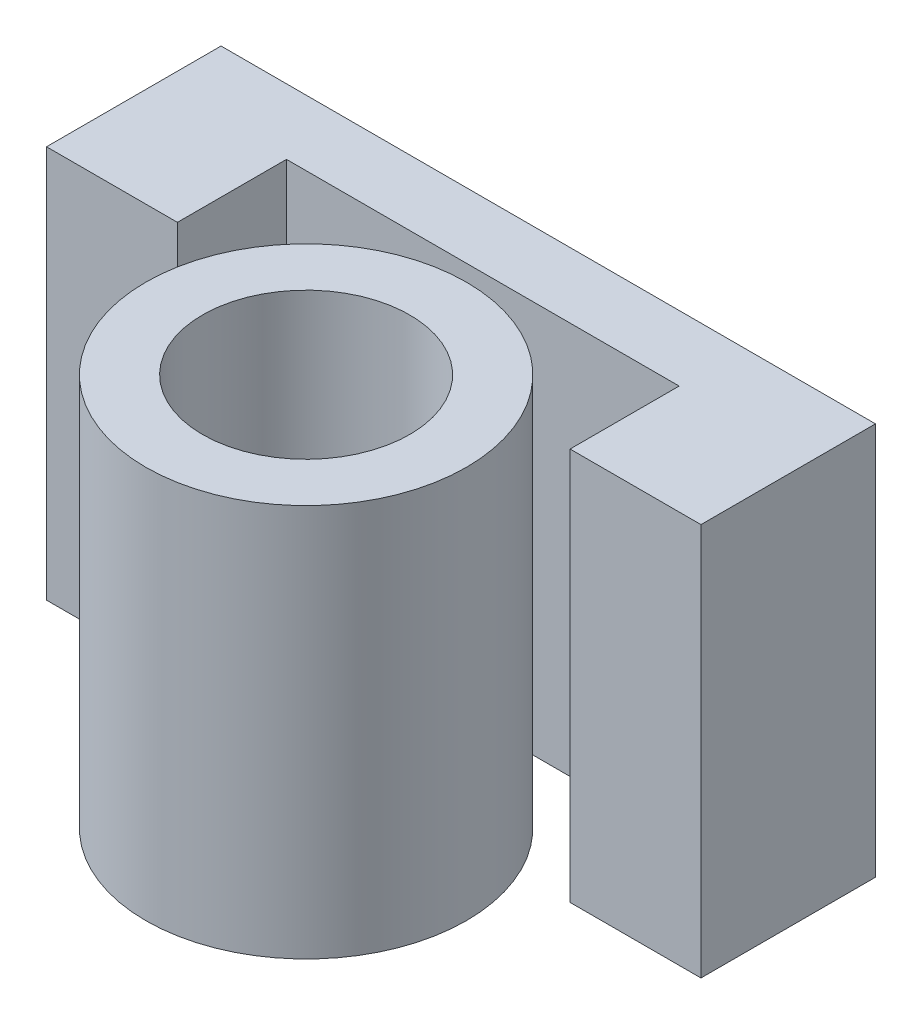
ISO-10303-21;
HEADER;
FILE_DESCRIPTION(('STEP AP214'),'2;1');
FILE_NAME('part.step','',(''),(''),'','','');
FILE_SCHEMA(('AUTOMOTIVE_DESIGN { 1 0 10303 214 1 1 1 1 }'));
ENDSEC;
DATA;
#1=APPLICATION_CONTEXT('core data for automotive mechanical design processes');
#2=APPLICATION_PROTOCOL_DEFINITION('international standard','automotive_design',2000,#1);
#3=PRODUCT_CONTEXT('',#1,'mechanical');
#4=PRODUCT('Part','Part','',(#3));
#5=PRODUCT_RELATED_PRODUCT_CATEGORY('part','',(#4));
#6=PRODUCT_DEFINITION_FORMATION('','',#4);
#7=PRODUCT_DEFINITION_CONTEXT('part definition',#1,'design');
#8=PRODUCT_DEFINITION('design','',#6,#7);
#9=PRODUCT_DEFINITION_SHAPE('','',#8);
#10=(LENGTH_UNIT() NAMED_UNIT(*) SI_UNIT(.MILLI.,.METRE.));
#11=(NAMED_UNIT(*) PLANE_ANGLE_UNIT() SI_UNIT($,.RADIAN.));
#12=(NAMED_UNIT(*) SI_UNIT($,.STERADIAN.) SOLID_ANGLE_UNIT());
#13=UNCERTAINTY_MEASURE_WITH_UNIT(LENGTH_MEASURE(1.E-05),#10,'distance_accuracy_value','');
#14=(GEOMETRIC_REPRESENTATION_CONTEXT(3) GLOBAL_UNCERTAINTY_ASSIGNED_CONTEXT((#13)) GLOBAL_UNIT_ASSIGNED_CONTEXT((#10,
#11,#12)) REPRESENTATION_CONTEXT('',''));
#15=CARTESIAN_POINT('',(0.,0.,0.));
#16=DIRECTION('',(0.,0.,1.));
#17=DIRECTION('',(1.,0.,0.));
#18=AXIS2_PLACEMENT_3D('',#15,#16,#17);
#19=CARTESIAN_POINT('',(-15.,18.,-3.1));
#20=DIRECTION('',(1.,0.,0.));
#21=DIRECTION('',(0.,0.,-1.));
#22=AXIS2_PLACEMENT_3D('',#19,#20,#21);
#23=PLANE('',#22);
#24=DIRECTION('',(0.,0.,1.));
#25=VECTOR('',#24,1.);
#26=CARTESIAN_POINT('',(-15.,0.,-3.1));
#27=LINE('',#26,#25);
#28=CARTESIAN_POINT('',(-15.,0.,-11.1));
#29=VERTEX_POINT('',#28);
#30=CARTESIAN_POINT('',(-15.,0.,-3.1));
#31=VERTEX_POINT('',#30);
#32=EDGE_CURVE('E12',#29,#31,#27,.T.);
#33=ORIENTED_EDGE('',*,*,#32,.T.);
#34=DIRECTION('',(0.,-1.,0.));
#35=VECTOR('',#34,1.);
#36=CARTESIAN_POINT('',(-15.,18.,-3.1));
#37=LINE('',#36,#35);
#38=CARTESIAN_POINT('',(-15.,18.,-3.1));
#39=VERTEX_POINT('',#38);
#40=EDGE_CURVE('E183',#39,#31,#37,.T.);
#41=ORIENTED_EDGE('',*,*,#40,.F.);
#42=DIRECTION('',(0.,0.,1.));
#43=VECTOR('',#42,1.);
#44=CARTESIAN_POINT('',(-15.,18.,-3.1));
#45=LINE('',#44,#43);
#46=CARTESIAN_POINT('',(-15.,18.,-11.1));
#47=VERTEX_POINT('',#46);
#48=EDGE_CURVE('E51',#47,#39,#45,.T.);
#49=ORIENTED_EDGE('',*,*,#48,.F.);
#50=DIRECTION('',(0.,-1.,0.));
#51=VECTOR('',#50,1.);
#52=CARTESIAN_POINT('',(-15.,18.,-11.1));
#53=LINE('',#52,#51);
#54=EDGE_CURVE('E151',#47,#29,#53,.T.);
#55=ORIENTED_EDGE('',*,*,#54,.T.);
#56=EDGE_LOOP('',(#33,#41,#49,#55));
#57=FACE_BOUND('',#56,.T.);
#58=ADVANCED_FACE('F47',(#57),#23,.F.);
#59=CARTESIAN_POINT('',(-15.,18.,-3.1));
#60=DIRECTION('',(0.,0.,-1.));
#61=DIRECTION('',(-1.,0.,0.));
#62=AXIS2_PLACEMENT_3D('',#59,#60,#61);
#63=PLANE('',#62);
#64=DIRECTION('',(1.,0.,0.));
#65=VECTOR('',#64,1.);
#66=CARTESIAN_POINT('',(-15.,0.,-3.1));
#67=LINE('',#66,#65);
#68=CARTESIAN_POINT('',(-9.,0.,-3.1));
#69=VERTEX_POINT('',#68);
#70=EDGE_CURVE('E57',#31,#69,#67,.T.);
#71=ORIENTED_EDGE('',*,*,#70,.T.);
#72=DIRECTION('',(0.,-1.,0.));
#73=VECTOR('',#72,1.);
#74=CARTESIAN_POINT('',(-9.,18.,-3.1));
#75=LINE('',#74,#73);
#76=CARTESIAN_POINT('',(-9.,18.,-3.1));
#77=VERTEX_POINT('',#76);
#78=EDGE_CURVE('E127',#77,#69,#75,.T.);
#79=ORIENTED_EDGE('',*,*,#78,.F.);
#80=DIRECTION('',(1.,0.,0.));
#81=VECTOR('',#80,1.);
#82=CARTESIAN_POINT('',(-15.,18.,-3.1));
#83=LINE('',#82,#81);
#84=EDGE_CURVE('E93',#39,#77,#83,.T.);
#85=ORIENTED_EDGE('',*,*,#84,.F.);
#86=ORIENTED_EDGE('',*,*,#40,.T.);
#87=EDGE_LOOP('',(#71,#79,#85,#86));
#88=FACE_BOUND('',#87,.T.);
#89=ADVANCED_FACE('F189',(#88),#63,.F.);
#90=CARTESIAN_POINT('',(-9.,18.,-3.1));
#91=DIRECTION('',(-1.,0.,0.));
#92=DIRECTION('',(0.,0.,1.));
#93=AXIS2_PLACEMENT_3D('',#90,#91,#92);
#94=PLANE('',#93);
#95=DIRECTION('',(0.,0.,-1.));
#96=VECTOR('',#95,1.);
#97=CARTESIAN_POINT('',(-9.,0.,-3.1));
#98=LINE('',#97,#96);
#99=CARTESIAN_POINT('',(-9.,0.,-8.1));
#100=VERTEX_POINT('',#99);
#101=EDGE_CURVE('E121',#69,#100,#98,.T.);
#102=ORIENTED_EDGE('',*,*,#101,.T.);
#103=DIRECTION('',(0.,-1.,0.));
#104=VECTOR('',#103,1.);
#105=CARTESIAN_POINT('',(-9.,18.,-8.1));
#106=LINE('',#105,#104);
#107=CARTESIAN_POINT('',(-9.,18.,-8.1));
#108=VERTEX_POINT('',#107);
#109=EDGE_CURVE('E125',#108,#100,#106,.T.);
#110=ORIENTED_EDGE('',*,*,#109,.F.);
#111=DIRECTION('',(0.,0.,-1.));
#112=VECTOR('',#111,1.);
#113=CARTESIAN_POINT('',(-9.,18.,-3.1));
#114=LINE('',#113,#112);
#115=EDGE_CURVE('E158',#77,#108,#114,.T.);
#116=ORIENTED_EDGE('',*,*,#115,.F.);
#117=ORIENTED_EDGE('',*,*,#78,.T.);
#118=EDGE_LOOP('',(#102,#110,#116,#117));
#119=FACE_BOUND('',#118,.T.);
#120=ADVANCED_FACE('F123',(#119),#94,.F.);
#121=CARTESIAN_POINT('',(-9.,18.,-8.1));
#122=DIRECTION('',(0.,0.,-1.));
#123=DIRECTION('',(-1.,0.,0.));
#124=AXIS2_PLACEMENT_3D('',#121,#122,#123);
#125=PLANE('',#124);
#126=DIRECTION('',(1.,0.,0.));
#127=VECTOR('',#126,1.);
#128=CARTESIAN_POINT('',(-9.,0.,-8.1));
#129=LINE('',#128,#127);
#130=CARTESIAN_POINT('',(9.,0.,-8.1));
#131=VERTEX_POINT('',#130);
#132=EDGE_CURVE('E129',#100,#131,#129,.T.);
#133=ORIENTED_EDGE('',*,*,#132,.T.);
#134=DIRECTION('',(0.,-1.,0.));
#135=VECTOR('',#134,1.);
#136=CARTESIAN_POINT('',(9.,18.,-8.1));
#137=LINE('',#136,#135);
#138=CARTESIAN_POINT('',(9.,18.,-8.1));
#139=VERTEX_POINT('',#138);
#140=EDGE_CURVE('E136',#139,#131,#137,.T.);
#141=ORIENTED_EDGE('',*,*,#140,.F.);
#142=DIRECTION('',(1.,0.,0.));
#143=VECTOR('',#142,1.);
#144=CARTESIAN_POINT('',(-9.,18.,-8.1));
#145=LINE('',#144,#143);
#146=EDGE_CURVE('E135',#108,#139,#145,.T.);
#147=ORIENTED_EDGE('',*,*,#146,.F.);
#148=ORIENTED_EDGE('',*,*,#109,.T.);
#149=EDGE_LOOP('',(#133,#141,#147,#148));
#150=FACE_BOUND('',#149,.T.);
#151=ADVANCED_FACE('F132',(#150),#125,.F.);
#152=CARTESIAN_POINT('',(9.,18.,-3.1));
#153=DIRECTION('',(1.,0.,0.));
#154=DIRECTION('',(0.,0.,-1.));
#155=AXIS2_PLACEMENT_3D('',#152,#153,#154);
#156=PLANE('',#155);
#157=DIRECTION('',(0.,0.,1.));
#158=VECTOR('',#157,1.);
#159=CARTESIAN_POINT('',(9.,0.,-3.1));
#160=LINE('',#159,#158);
#161=CARTESIAN_POINT('',(9.,0.,-3.1));
#162=VERTEX_POINT('',#161);
#163=EDGE_CURVE('E141',#131,#162,#160,.T.);
#164=ORIENTED_EDGE('',*,*,#163,.T.);
#165=DIRECTION('',(0.,-1.,0.));
#166=VECTOR('',#165,1.);
#167=CARTESIAN_POINT('',(9.,18.,-3.1));
#168=LINE('',#167,#166);
#169=CARTESIAN_POINT('',(9.,18.,-3.1));
#170=VERTEX_POINT('',#169);
#171=EDGE_CURVE('E175',#170,#162,#168,.T.);
#172=ORIENTED_EDGE('',*,*,#171,.F.);
#173=DIRECTION('',(0.,0.,1.));
#174=VECTOR('',#173,1.);
#175=CARTESIAN_POINT('',(9.,18.,-3.1));
#176=LINE('',#175,#174);
#177=EDGE_CURVE('E155',#139,#170,#176,.T.);
#178=ORIENTED_EDGE('',*,*,#177,.F.);
#179=ORIENTED_EDGE('',*,*,#140,.T.);
#180=EDGE_LOOP('',(#164,#172,#178,#179));
#181=FACE_BOUND('',#180,.T.);
#182=ADVANCED_FACE('F192',(#181),#156,.F.);
#183=CARTESIAN_POINT('',(15.,18.,-3.1));
#184=DIRECTION('',(0.,0.,-1.));
#185=DIRECTION('',(-1.,0.,0.));
#186=AXIS2_PLACEMENT_3D('',#183,#184,#185);
#187=PLANE('',#186);
#188=DIRECTION('',(1.,0.,0.));
#189=VECTOR('',#188,1.);
#190=CARTESIAN_POINT('',(15.,0.,-3.1));
#191=LINE('',#190,#189);
#192=CARTESIAN_POINT('',(15.,0.,-3.1));
#193=VERTEX_POINT('',#192);
#194=EDGE_CURVE('E143',#162,#193,#191,.T.);
#195=ORIENTED_EDGE('',*,*,#194,.T.);
#196=DIRECTION('',(0.,-1.,0.));
#197=VECTOR('',#196,1.);
#198=CARTESIAN_POINT('',(15.,18.,-3.1));
#199=LINE('',#198,#197);
#200=CARTESIAN_POINT('',(15.,18.,-3.1));
#201=VERTEX_POINT('',#200);
#202=EDGE_CURVE('E172',#201,#193,#199,.T.);
#203=ORIENTED_EDGE('',*,*,#202,.F.);
#204=DIRECTION('',(1.,0.,0.));
#205=VECTOR('',#204,1.);
#206=CARTESIAN_POINT('',(15.,18.,-3.1));
#207=LINE('',#206,#205);
#208=EDGE_CURVE('E153',#170,#201,#207,.T.);
#209=ORIENTED_EDGE('',*,*,#208,.F.);
#210=ORIENTED_EDGE('',*,*,#171,.T.);
#211=EDGE_LOOP('',(#195,#203,#209,#210));
#212=FACE_BOUND('',#211,.T.);
#213=ADVANCED_FACE('F170',(#212),#187,.F.);
#214=CARTESIAN_POINT('',(15.,18.,-3.1));
#215=DIRECTION('',(-1.,0.,0.));
#216=DIRECTION('',(0.,0.,1.));
#217=AXIS2_PLACEMENT_3D('',#214,#215,#216);
#218=PLANE('',#217);
#219=DIRECTION('',(0.,0.,-1.));
#220=VECTOR('',#219,1.);
#221=CARTESIAN_POINT('',(15.,0.,-3.1));
#222=LINE('',#221,#220);
#223=CARTESIAN_POINT('',(15.,0.,-11.1));
#224=VERTEX_POINT('',#223);
#225=EDGE_CURVE('E161',#193,#224,#222,.T.);
#226=ORIENTED_EDGE('',*,*,#225,.T.);
#227=DIRECTION('',(0.,-1.,0.));
#228=VECTOR('',#227,1.);
#229=CARTESIAN_POINT('',(15.,18.,-11.1));
#230=LINE('',#229,#228);
#231=CARTESIAN_POINT('',(15.,18.,-11.1));
#232=VERTEX_POINT('',#231);
#233=EDGE_CURVE('E180',#232,#224,#230,.T.);
#234=ORIENTED_EDGE('',*,*,#233,.F.);
#235=DIRECTION('',(0.,0.,-1.));
#236=VECTOR('',#235,1.);
#237=CARTESIAN_POINT('',(15.,18.,-3.1));
#238=LINE('',#237,#236);
#239=EDGE_CURVE('E150',#201,#232,#238,.T.);
#240=ORIENTED_EDGE('',*,*,#239,.F.);
#241=ORIENTED_EDGE('',*,*,#202,.T.);
#242=EDGE_LOOP('',(#226,#234,#240,#241));
#243=FACE_BOUND('',#242,.T.);
#244=ADVANCED_FACE('F178',(#243),#218,.F.);
#245=CARTESIAN_POINT('',(-15.,18.,-11.1));
#246=DIRECTION('',(0.,0.,1.));
#247=DIRECTION('',(1.,0.,0.));
#248=AXIS2_PLACEMENT_3D('',#245,#246,#247);
#249=PLANE('',#248);
#250=DIRECTION('',(-1.,0.,0.));
#251=VECTOR('',#250,1.);
#252=CARTESIAN_POINT('',(-15.,0.,-11.1));
#253=LINE('',#252,#251);
#254=EDGE_CURVE('E104',#224,#29,#253,.T.);
#255=ORIENTED_EDGE('',*,*,#254,.T.);
#256=ORIENTED_EDGE('',*,*,#54,.F.);
#257=DIRECTION('',(-1.,0.,0.));
#258=VECTOR('',#257,1.);
#259=CARTESIAN_POINT('',(-15.,18.,-11.1));
#260=LINE('',#259,#258);
#261=EDGE_CURVE('E148',#232,#47,#260,.T.);
#262=ORIENTED_EDGE('',*,*,#261,.F.);
#263=ORIENTED_EDGE('',*,*,#233,.T.);
#264=EDGE_LOOP('',(#255,#256,#262,#263));
#265=FACE_BOUND('',#264,.T.);
#266=ADVANCED_FACE('F193',(#265),#249,.F.);
#267=CARTESIAN_POINT('',(0.,18.,0.));
#268=DIRECTION('',(0.,-1.,0.));
#269=DIRECTION('',(0.,0.,-1.));
#270=AXIS2_PLACEMENT_3D('',#267,#268,#269);
#271=PLANE('',#270);
#272=ORIENTED_EDGE('',*,*,#48,.T.);
#273=ORIENTED_EDGE('',*,*,#84,.T.);
#274=ORIENTED_EDGE('',*,*,#115,.T.);
#275=ORIENTED_EDGE('',*,*,#146,.T.);
#276=ORIENTED_EDGE('',*,*,#177,.T.);
#277=ORIENTED_EDGE('',*,*,#208,.T.);
#278=ORIENTED_EDGE('',*,*,#239,.T.);
#279=ORIENTED_EDGE('',*,*,#261,.T.);
#280=EDGE_LOOP('',(#272,#273,#274,#275,#276,#277,#278,#279));
#281=FACE_BOUND('',#280,.T.);
#282=ADVANCED_FACE('F49',(#281),#271,.F.);
#283=CARTESIAN_POINT('',(0.,0.,0.));
#284=DIRECTION('',(0.,-1.,0.));
#285=DIRECTION('',(0.,0.,-1.));
#286=AXIS2_PLACEMENT_3D('',#283,#284,#285);
#287=PLANE('',#286);
#288=ORIENTED_EDGE('',*,*,#32,.F.);
#289=ORIENTED_EDGE('',*,*,#254,.F.);
#290=ORIENTED_EDGE('',*,*,#225,.F.);
#291=ORIENTED_EDGE('',*,*,#194,.F.);
#292=ORIENTED_EDGE('',*,*,#163,.F.);
#293=ORIENTED_EDGE('',*,*,#132,.F.);
#294=ORIENTED_EDGE('',*,*,#101,.F.);
#295=ORIENTED_EDGE('',*,*,#70,.F.);
#296=EDGE_LOOP('',(#288,#289,#290,#291,#292,#293,#294,#295));
#297=FACE_BOUND('',#296,.T.);
#298=ADVANCED_FACE('F139',(#297),#287,.T.);
#299=CLOSED_SHELL('',(#58,#89,#120,#151,#182,#213,#244,#266,#282,#298));
#300=MANIFOLD_SOLID_BREP('B2',#299);
#301=CARTESIAN_POINT('',(0.,18.,0.));
#302=DIRECTION('',(0.,1.,0.));
#303=DIRECTION('',(0.,0.,1.));
#304=AXIS2_PLACEMENT_3D('',#301,#302,#303);
#305=PLANE('',#304);
#306=CARTESIAN_POINT('',(0.,18.,0.));
#307=DIRECTION('',(0.,1.,0.));
#308=DIRECTION('',(0.,0.,1.));
#309=AXIS2_PLACEMENT_3D('',#306,#307,#308);
#310=CIRCLE('',#309,7.35);
#311=CARTESIAN_POINT('',(0.,18.,7.35));
#312=VERTEX_POINT('',#311);
#313=EDGE_CURVE('E46',#312,#312,#310,.T.);
#314=ORIENTED_EDGE('',*,*,#313,.T.);
#315=EDGE_LOOP('',(#314));
#316=FACE_BOUND('',#315,.T.);
#317=CARTESIAN_POINT('',(0.,18.,0.));
#318=DIRECTION('',(0.,1.,0.));
#319=DIRECTION('',(0.,0.,1.));
#320=AXIS2_PLACEMENT_3D('',#317,#318,#319);
#321=CIRCLE('',#320,4.75);
#322=CARTESIAN_POINT('',(0.,18.,4.75));
#323=VERTEX_POINT('',#322);
#324=EDGE_CURVE('E286',#323,#323,#321,.T.);
#325=ORIENTED_EDGE('',*,*,#324,.F.);
#326=EDGE_LOOP('',(#325));
#327=FACE_BOUND('',#326,.T.);
#328=ADVANCED_FACE('F275',(#316,#327),#305,.T.);
#329=CARTESIAN_POINT('',(0.,0.,0.));
#330=DIRECTION('',(0.,1.,0.));
#331=DIRECTION('',(0.,0.,1.));
#332=AXIS2_PLACEMENT_3D('',#329,#330,#331);
#333=PLANE('',#332);
#334=CARTESIAN_POINT('',(0.,0.,0.));
#335=DIRECTION('',(0.,1.,0.));
#336=DIRECTION('',(0.,0.,1.));
#337=AXIS2_PLACEMENT_3D('',#334,#335,#336);
#338=CIRCLE('',#337,7.35);
#339=CARTESIAN_POINT('',(0.,0.,7.35));
#340=VERTEX_POINT('',#339);
#341=EDGE_CURVE('E279',#340,#340,#338,.T.);
#342=ORIENTED_EDGE('',*,*,#341,.F.);
#343=EDGE_LOOP('',(#342));
#344=FACE_BOUND('',#343,.T.);
#345=CARTESIAN_POINT('',(0.,0.,0.));
#346=DIRECTION('',(0.,1.,0.));
#347=DIRECTION('',(0.,0.,1.));
#348=AXIS2_PLACEMENT_3D('',#345,#346,#347);
#349=CIRCLE('',#348,4.75);
#350=CARTESIAN_POINT('',(0.,0.,4.75));
#351=VERTEX_POINT('',#350);
#352=EDGE_CURVE('E288',#351,#351,#349,.T.);
#353=ORIENTED_EDGE('',*,*,#352,.T.);
#354=EDGE_LOOP('',(#353));
#355=FACE_BOUND('',#354,.T.);
#356=ADVANCED_FACE('F298',(#344,#355),#333,.F.);
#357=CARTESIAN_POINT('',(0.,18.,0.));
#358=DIRECTION('',(0.,-1.,0.));
#359=DIRECTION('',(0.,0.,-1.));
#360=AXIS2_PLACEMENT_3D('',#357,#358,#359);
#361=CYLINDRICAL_SURFACE('',#360,7.35);
#362=ORIENTED_EDGE('',*,*,#313,.F.);
#363=EDGE_LOOP('',(#362));
#364=FACE_BOUND('',#363,.T.);
#365=ORIENTED_EDGE('',*,*,#341,.T.);
#366=EDGE_LOOP('',(#365));
#367=FACE_BOUND('',#366,.T.);
#368=ADVANCED_FACE('F277',(#364,#367),#361,.T.);
#369=CARTESIAN_POINT('',(0.,18.,0.));
#370=DIRECTION('',(0.,-1.,0.));
#371=DIRECTION('',(0.,0.,-1.));
#372=AXIS2_PLACEMENT_3D('',#369,#370,#371);
#373=CYLINDRICAL_SURFACE('',#372,4.75);
#374=ORIENTED_EDGE('',*,*,#324,.T.);
#375=EDGE_LOOP('',(#374));
#376=FACE_BOUND('',#375,.T.);
#377=ORIENTED_EDGE('',*,*,#352,.F.);
#378=EDGE_LOOP('',(#377));
#379=FACE_BOUND('',#378,.T.);
#380=ADVANCED_FACE('F294',(#376,#379),#373,.F.);
#381=CLOSED_SHELL('',(#328,#356,#368,#380));
#382=MANIFOLD_SOLID_BREP('B6',#381);
#383=ADVANCED_BREP_SHAPE_REPRESENTATION('',(#18,#300,#382),#14);
#384=SHAPE_DEFINITION_REPRESENTATION(#9,#383);
ENDSEC;
END-ISO-10303-21;
